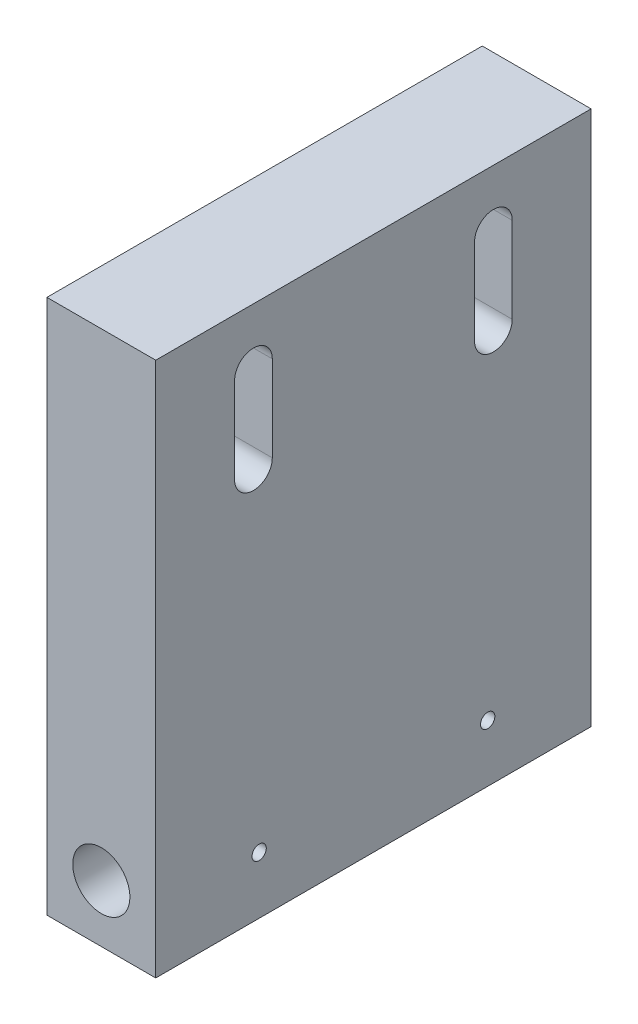
ISO-10303-21;
HEADER;
FILE_DESCRIPTION(('STEP AP214'),'2;1');
FILE_NAME('part.step','',(''),(''),'','','');
FILE_SCHEMA(('AUTOMOTIVE_DESIGN { 1 0 10303 214 1 1 1 1 }'));
ENDSEC;
DATA;
#1=APPLICATION_CONTEXT('core data for automotive mechanical design processes');
#2=APPLICATION_PROTOCOL_DEFINITION('international standard','automotive_design',2000,#1);
#3=PRODUCT_CONTEXT('',#1,'mechanical');
#4=PRODUCT('Part','Part','',(#3));
#5=PRODUCT_RELATED_PRODUCT_CATEGORY('part','',(#4));
#6=PRODUCT_DEFINITION_FORMATION('','',#4);
#7=PRODUCT_DEFINITION_CONTEXT('part definition',#1,'design');
#8=PRODUCT_DEFINITION('design','',#6,#7);
#9=PRODUCT_DEFINITION_SHAPE('','',#8);
#10=(LENGTH_UNIT() NAMED_UNIT(*) SI_UNIT(.MILLI.,.METRE.));
#11=(NAMED_UNIT(*) PLANE_ANGLE_UNIT() SI_UNIT($,.RADIAN.));
#12=(NAMED_UNIT(*) SI_UNIT($,.STERADIAN.) SOLID_ANGLE_UNIT());
#13=UNCERTAINTY_MEASURE_WITH_UNIT(LENGTH_MEASURE(1.E-05),#10,'distance_accuracy_value','');
#14=(GEOMETRIC_REPRESENTATION_CONTEXT(3) GLOBAL_UNCERTAINTY_ASSIGNED_CONTEXT((#13)) GLOBAL_UNIT_ASSIGNED_CONTEXT((#10,
#11,#12)) REPRESENTATION_CONTEXT('',''));
#15=CARTESIAN_POINT('',(0.,0.,0.));
#16=DIRECTION('',(0.,0.,1.));
#17=DIRECTION('',(1.,0.,0.));
#18=AXIS2_PLACEMENT_3D('',#15,#16,#17);
#19=CARTESIAN_POINT('',(9.52499999999986,0.,38.1));
#20=DIRECTION('',(-1.,0.,0.));
#21=DIRECTION('',(0.,0.,1.));
#22=AXIS2_PLACEMENT_3D('',#19,#20,#21);
#23=PLANE('',#22);
#24=DIRECTION('',(0.,-1.,0.));
#25=VECTOR('',#24,1.);
#26=CARTESIAN_POINT('',(9.52500000000006,83.65,-17.7));
#27=LINE('',#26,#25);
#28=CARTESIAN_POINT('',(9.52500000000006,83.65,-17.7));
#29=VERTEX_POINT('',#28);
#30=CARTESIAN_POINT('',(9.52500000000006,68.65,-17.7));
#31=VERTEX_POINT('',#30);
#32=EDGE_CURVE('E171',#29,#31,#27,.T.);
#33=ORIENTED_EDGE('',*,*,#32,.F.);
#34=CARTESIAN_POINT('',(9.52500000000007,83.65,-21.));
#35=DIRECTION('',(1.,0.,0.));
#36=DIRECTION('',(0.,0.,1.));
#37=AXIS2_PLACEMENT_3D('',#34,#35,#36);
#38=CIRCLE('',#37,3.3);
#39=CARTESIAN_POINT('',(9.52500000000008,83.65,-24.3));
#40=VERTEX_POINT('',#39);
#41=EDGE_CURVE('E67',#40,#29,#38,.T.);
#42=ORIENTED_EDGE('',*,*,#41,.F.);
#43=DIRECTION('',(0.,1.,0.));
#44=VECTOR('',#43,1.);
#45=CARTESIAN_POINT('',(9.52500000000008,83.65,-24.3));
#46=LINE('',#45,#44);
#47=CARTESIAN_POINT('',(9.52500000000008,68.65,-24.3));
#48=VERTEX_POINT('',#47);
#49=EDGE_CURVE('E159',#48,#40,#46,.T.);
#50=ORIENTED_EDGE('',*,*,#49,.F.);
#51=CARTESIAN_POINT('',(9.52500000000007,68.65,-21.));
#52=DIRECTION('',(1.,0.,0.));
#53=DIRECTION('',(0.,0.,1.));
#54=AXIS2_PLACEMENT_3D('',#51,#52,#53);
#55=CIRCLE('',#54,3.3);
#56=EDGE_CURVE('E162',#31,#48,#55,.T.);
#57=ORIENTED_EDGE('',*,*,#56,.F.);
#58=EDGE_LOOP('',(#33,#42,#50,#57));
#59=FACE_BOUND('',#58,.T.);
#60=DIRECTION('',(0.,-1.,0.));
#61=VECTOR('',#60,1.);
#62=CARTESIAN_POINT('',(9.52499999999992,83.65,24.3000000000001));
#63=LINE('',#62,#61);
#64=CARTESIAN_POINT('',(9.52499999999991,83.65,24.3000000000001));
#65=VERTEX_POINT('',#64);
#66=CARTESIAN_POINT('',(9.52499999999991,68.65,24.3000000000001));
#67=VERTEX_POINT('',#66);
#68=EDGE_CURVE('E196',#65,#67,#63,.T.);
#69=ORIENTED_EDGE('',*,*,#68,.F.);
#70=CARTESIAN_POINT('',(9.52499999999993,83.65,21.0000000000001));
#71=DIRECTION('',(1.,0.,0.));
#72=DIRECTION('',(0.,0.,-1.));
#73=AXIS2_PLACEMENT_3D('',#70,#71,#72);
#74=CIRCLE('',#73,3.3);
#75=CARTESIAN_POINT('',(9.52499999999994,83.65,17.7000000000001));
#76=VERTEX_POINT('',#75);
#77=EDGE_CURVE('E177',#76,#65,#74,.T.);
#78=ORIENTED_EDGE('',*,*,#77,.F.);
#79=DIRECTION('',(0.,1.,0.));
#80=VECTOR('',#79,1.);
#81=CARTESIAN_POINT('',(9.52499999999994,83.65,17.7000000000001));
#82=LINE('',#81,#80);
#83=CARTESIAN_POINT('',(9.52499999999994,68.65,17.7000000000001));
#84=VERTEX_POINT('',#83);
#85=EDGE_CURVE('E185',#84,#76,#82,.T.);
#86=ORIENTED_EDGE('',*,*,#85,.F.);
#87=CARTESIAN_POINT('',(9.52499999999993,68.65,21.0000000000001));
#88=DIRECTION('',(1.,0.,0.));
#89=DIRECTION('',(0.,0.,-1.));
#90=AXIS2_PLACEMENT_3D('',#87,#88,#89);
#91=CIRCLE('',#90,3.3);
#92=EDGE_CURVE('E199',#67,#84,#91,.T.);
#93=ORIENTED_EDGE('',*,*,#92,.F.);
#94=EDGE_LOOP('',(#69,#78,#86,#93));
#95=FACE_BOUND('',#94,.T.);
#96=DIRECTION('',(0.,0.,1.));
#97=VECTOR('',#96,1.);
#98=CARTESIAN_POINT('',(9.52499999999986,93.65,38.1));
#99=LINE('',#98,#97);
#100=CARTESIAN_POINT('',(9.52500000000014,93.65,-38.1));
#101=VERTEX_POINT('',#100);
#102=CARTESIAN_POINT('',(9.52499999999986,93.65,38.1));
#103=VERTEX_POINT('',#102);
#104=EDGE_CURVE('E226',#101,#103,#99,.T.);
#105=ORIENTED_EDGE('',*,*,#104,.T.);
#106=DIRECTION('',(0.,1.,0.));
#107=VECTOR('',#106,1.);
#108=CARTESIAN_POINT('',(9.52499999999986,0.,38.1));
#109=LINE('',#108,#107);
#110=CARTESIAN_POINT('',(9.52499999999986,0.,38.1));
#111=VERTEX_POINT('',#110);
#112=EDGE_CURVE('E60',#111,#103,#109,.T.);
#113=ORIENTED_EDGE('',*,*,#112,.F.);
#114=DIRECTION('',(0.,0.,1.));
#115=VECTOR('',#114,1.);
#116=CARTESIAN_POINT('',(9.52499999999986,0.,38.1));
#117=LINE('',#116,#115);
#118=CARTESIAN_POINT('',(9.52500000000014,0.,-38.1));
#119=VERTEX_POINT('',#118);
#120=EDGE_CURVE('E216',#119,#111,#117,.T.);
#121=ORIENTED_EDGE('',*,*,#120,.F.);
#122=DIRECTION('',(0.,1.,0.));
#123=VECTOR('',#122,1.);
#124=CARTESIAN_POINT('',(9.52500000000014,0.,-38.1));
#125=LINE('',#124,#123);
#126=EDGE_CURVE('E12',#119,#101,#125,.T.);
#127=ORIENTED_EDGE('',*,*,#126,.T.);
#128=EDGE_LOOP('',(#105,#113,#121,#127));
#129=FACE_BOUND('',#128,.T.);
#130=CARTESIAN_POINT('',(9.52499999999993,10.,20.));
#131=DIRECTION('',(1.,0.,0.));
#132=DIRECTION('',(0.,0.,-1.));
#133=AXIS2_PLACEMENT_3D('',#130,#131,#132);
#134=CIRCLE('',#133,1.24999999999999);
#135=CARTESIAN_POINT('',(9.52499999999993,10.,18.75));
#136=VERTEX_POINT('',#135);
#137=EDGE_CURVE('E261',#136,#136,#134,.T.);
#138=ORIENTED_EDGE('',*,*,#137,.F.);
#139=EDGE_LOOP('',(#138));
#140=FACE_BOUND('',#139,.T.);
#141=CARTESIAN_POINT('',(9.52500000000007,10.,-20.));
#142=DIRECTION('',(1.,0.,0.));
#143=DIRECTION('',(0.,0.,-1.));
#144=AXIS2_PLACEMENT_3D('',#141,#142,#143);
#145=CIRCLE('',#144,1.24999999999999);
#146=CARTESIAN_POINT('',(9.52500000000007,10.,-21.25));
#147=VERTEX_POINT('',#146);
#148=EDGE_CURVE('E264',#147,#147,#145,.T.);
#149=ORIENTED_EDGE('',*,*,#148,.F.);
#150=EDGE_LOOP('',(#149));
#151=FACE_BOUND('',#150,.T.);
#152=ADVANCED_FACE('F52',(#59,#95,#129,#140,#151),#23,.F.);
#153=CARTESIAN_POINT('',(-9.52499999999987,0.,-38.1));
#154=DIRECTION('',(0.,0.,1.));
#155=DIRECTION('',(1.,0.,0.));
#156=AXIS2_PLACEMENT_3D('',#153,#154,#155);
#157=PLANE('',#156);
#158=CARTESIAN_POINT('',(1.38777878078145E-13,10.,-38.1));
#159=DIRECTION('',(0.,0.,-1.));
#160=DIRECTION('',(0.,1.,0.));
#161=AXIS2_PLACEMENT_3D('',#158,#159,#160);
#162=CIRCLE('',#161,4.99999999999999);
#163=CARTESIAN_POINT('',(1.38777878078145E-13,15.,-38.1));
#164=VERTEX_POINT('',#163);
#165=EDGE_CURVE('E302',#164,#164,#162,.T.);
#166=ORIENTED_EDGE('',*,*,#165,.F.);
#167=EDGE_LOOP('',(#166));
#168=FACE_BOUND('',#167,.T.);
#169=DIRECTION('',(1.,0.,0.));
#170=VECTOR('',#169,1.);
#171=CARTESIAN_POINT('',(-9.52499999999987,93.65,-38.1));
#172=LINE('',#171,#170);
#173=CARTESIAN_POINT('',(-9.52499999999987,93.65,-38.1));
#174=VERTEX_POINT('',#173);
#175=EDGE_CURVE('E206',#174,#101,#172,.T.);
#176=ORIENTED_EDGE('',*,*,#175,.T.);
#177=ORIENTED_EDGE('',*,*,#126,.F.);
#178=DIRECTION('',(1.,0.,0.));
#179=VECTOR('',#178,1.);
#180=CARTESIAN_POINT('',(-9.52499999999987,0.,-38.1));
#181=LINE('',#180,#179);
#182=CARTESIAN_POINT('',(-9.52499999999987,0.,-38.1));
#183=VERTEX_POINT('',#182);
#184=EDGE_CURVE('E213',#183,#119,#181,.T.);
#185=ORIENTED_EDGE('',*,*,#184,.F.);
#186=DIRECTION('',(0.,1.,0.));
#187=VECTOR('',#186,1.);
#188=CARTESIAN_POINT('',(-9.52499999999987,0.,-38.1));
#189=LINE('',#188,#187);
#190=EDGE_CURVE('E223',#183,#174,#189,.T.);
#191=ORIENTED_EDGE('',*,*,#190,.T.);
#192=EDGE_LOOP('',(#176,#177,#185,#191));
#193=FACE_BOUND('',#192,.T.);
#194=ADVANCED_FACE('F54',(#168,#193),#157,.F.);
#195=CARTESIAN_POINT('',(-9.52500000000014,0.,38.1));
#196=DIRECTION('',(0.,0.,-1.));
#197=DIRECTION('',(-1.,0.,0.));
#198=AXIS2_PLACEMENT_3D('',#195,#196,#197);
#199=PLANE('',#198);
#200=CARTESIAN_POINT('',(1.38777878078145E-13,10.,38.1));
#201=DIRECTION('',(0.,0.,-1.));
#202=DIRECTION('',(0.,1.,0.));
#203=AXIS2_PLACEMENT_3D('',#200,#201,#202);
#204=CIRCLE('',#203,4.99999999999998);
#205=CARTESIAN_POINT('',(1.38777878078145E-13,15.,38.1));
#206=VERTEX_POINT('',#205);
#207=EDGE_CURVE('E165',#206,#206,#204,.T.);
#208=ORIENTED_EDGE('',*,*,#207,.T.);
#209=EDGE_LOOP('',(#208));
#210=FACE_BOUND('',#209,.T.);
#211=DIRECTION('',(-1.,0.,0.));
#212=VECTOR('',#211,1.);
#213=CARTESIAN_POINT('',(-9.52500000000014,93.65,38.1));
#214=LINE('',#213,#212);
#215=CARTESIAN_POINT('',(-9.52500000000014,93.65,38.1));
#216=VERTEX_POINT('',#215);
#217=EDGE_CURVE('E228',#103,#216,#214,.T.);
#218=ORIENTED_EDGE('',*,*,#217,.T.);
#219=DIRECTION('',(0.,1.,0.));
#220=VECTOR('',#219,1.);
#221=CARTESIAN_POINT('',(-9.52500000000014,0.,38.1));
#222=LINE('',#221,#220);
#223=CARTESIAN_POINT('',(-9.52500000000014,0.,38.1));
#224=VERTEX_POINT('',#223);
#225=EDGE_CURVE('E233',#224,#216,#222,.T.);
#226=ORIENTED_EDGE('',*,*,#225,.F.);
#227=DIRECTION('',(-1.,0.,0.));
#228=VECTOR('',#227,1.);
#229=CARTESIAN_POINT('',(-9.52500000000014,0.,38.1));
#230=LINE('',#229,#228);
#231=EDGE_CURVE('E219',#111,#224,#230,.T.);
#232=ORIENTED_EDGE('',*,*,#231,.F.);
#233=ORIENTED_EDGE('',*,*,#112,.T.);
#234=EDGE_LOOP('',(#218,#226,#232,#233));
#235=FACE_BOUND('',#234,.T.);
#236=ADVANCED_FACE('F240',(#210,#235),#199,.F.);
#237=CARTESIAN_POINT('',(-9.52500000000014,0.,38.1));
#238=DIRECTION('',(1.,0.,0.));
#239=DIRECTION('',(0.,0.,-1.));
#240=AXIS2_PLACEMENT_3D('',#237,#238,#239);
#241=PLANE('',#240);
#242=DIRECTION('',(0.,1.,0.));
#243=VECTOR('',#242,1.);
#244=CARTESIAN_POINT('',(-9.52500000000019,83.65,-24.3000000000001));
#245=LINE('',#244,#243);
#246=CARTESIAN_POINT('',(-9.52500000000019,68.65,-24.3000000000001));
#247=VERTEX_POINT('',#246);
#248=CARTESIAN_POINT('',(-9.52500000000019,83.65,-24.3000000000001));
#249=VERTEX_POINT('',#248);
#250=EDGE_CURVE('E149',#247,#249,#245,.T.);
#251=ORIENTED_EDGE('',*,*,#250,.T.);
#252=CARTESIAN_POINT('',(-9.5250000000002,83.65,-21.0000000000001));
#253=DIRECTION('',(1.,0.,0.));
#254=DIRECTION('',(0.,0.,1.));
#255=AXIS2_PLACEMENT_3D('',#252,#253,#254);
#256=CIRCLE('',#255,3.3);
#257=CARTESIAN_POINT('',(-9.52500000000021,83.65,-17.7000000000001));
#258=VERTEX_POINT('',#257);
#259=EDGE_CURVE('E143',#249,#258,#256,.T.);
#260=ORIENTED_EDGE('',*,*,#259,.T.);
#261=DIRECTION('',(0.,-1.,0.));
#262=VECTOR('',#261,1.);
#263=CARTESIAN_POINT('',(-9.52500000000021,83.65,-17.7000000000001));
#264=LINE('',#263,#262);
#265=CARTESIAN_POINT('',(-9.52499999999994,68.65,-17.7000000000001));
#266=VERTEX_POINT('',#265);
#267=EDGE_CURVE('E152',#258,#266,#264,.T.);
#268=ORIENTED_EDGE('',*,*,#267,.T.);
#269=CARTESIAN_POINT('',(-9.5250000000002,68.65,-21.0000000000001));
#270=DIRECTION('',(1.,0.,0.));
#271=DIRECTION('',(0.,0.,1.));
#272=AXIS2_PLACEMENT_3D('',#269,#270,#271);
#273=CIRCLE('',#272,3.3);
#274=EDGE_CURVE('E75',#266,#247,#273,.T.);
#275=ORIENTED_EDGE('',*,*,#274,.T.);
#276=EDGE_LOOP('',(#251,#260,#268,#275));
#277=FACE_BOUND('',#276,.T.);
#278=DIRECTION('',(0.,1.,0.));
#279=VECTOR('',#278,1.);
#280=CARTESIAN_POINT('',(-9.52500000000034,83.65,17.7));
#281=LINE('',#280,#279);
#282=CARTESIAN_POINT('',(-9.52500000000034,68.65,17.7));
#283=VERTEX_POINT('',#282);
#284=CARTESIAN_POINT('',(-9.52500000000034,83.65,17.7));
#285=VERTEX_POINT('',#284);
#286=EDGE_CURVE('E191',#283,#285,#281,.T.);
#287=ORIENTED_EDGE('',*,*,#286,.T.);
#288=CARTESIAN_POINT('',(-9.52500000000035,83.65,21.));
#289=DIRECTION('',(1.,0.,0.));
#290=DIRECTION('',(0.,0.,-1.));
#291=AXIS2_PLACEMENT_3D('',#288,#289,#290);
#292=CIRCLE('',#291,3.3);
#293=CARTESIAN_POINT('',(-9.52500000000036,83.65,24.3));
#294=VERTEX_POINT('',#293);
#295=EDGE_CURVE('E181',#285,#294,#292,.T.);
#296=ORIENTED_EDGE('',*,*,#295,.T.);
#297=DIRECTION('',(0.,-1.,0.));
#298=VECTOR('',#297,1.);
#299=CARTESIAN_POINT('',(-9.52500000000036,83.65,24.3));
#300=LINE('',#299,#298);
#301=CARTESIAN_POINT('',(-9.52500000000009,68.65,24.3));
#302=VERTEX_POINT('',#301);
#303=EDGE_CURVE('E184',#294,#302,#300,.T.);
#304=ORIENTED_EDGE('',*,*,#303,.T.);
#305=CARTESIAN_POINT('',(-9.52500000000035,68.65,21.));
#306=DIRECTION('',(1.,0.,0.));
#307=DIRECTION('',(0.,0.,-1.));
#308=AXIS2_PLACEMENT_3D('',#305,#306,#307);
#309=CIRCLE('',#308,3.3);
#310=EDGE_CURVE('E188',#302,#283,#309,.T.);
#311=ORIENTED_EDGE('',*,*,#310,.T.);
#312=EDGE_LOOP('',(#287,#296,#304,#311));
#313=FACE_BOUND('',#312,.T.);
#314=DIRECTION('',(0.,0.,-1.));
#315=VECTOR('',#314,1.);
#316=CARTESIAN_POINT('',(-9.52500000000014,93.65,38.1));
#317=LINE('',#316,#315);
#318=EDGE_CURVE('E217',#216,#174,#317,.T.);
#319=ORIENTED_EDGE('',*,*,#318,.T.);
#320=ORIENTED_EDGE('',*,*,#190,.F.);
#321=DIRECTION('',(0.,0.,-1.));
#322=VECTOR('',#321,1.);
#323=CARTESIAN_POINT('',(-9.52500000000014,0.,38.1));
#324=LINE('',#323,#322);
#325=EDGE_CURVE('E221',#224,#183,#324,.T.);
#326=ORIENTED_EDGE('',*,*,#325,.F.);
#327=ORIENTED_EDGE('',*,*,#225,.T.);
#328=EDGE_LOOP('',(#319,#320,#326,#327));
#329=FACE_BOUND('',#328,.T.);
#330=ADVANCED_FACE('F156',(#277,#313,#329),#241,.F.);
#331=CARTESIAN_POINT('',(0.,0.,0.));
#332=DIRECTION('',(0.,1.,0.));
#333=DIRECTION('',(-1.,0.,0.));
#334=AXIS2_PLACEMENT_3D('',#331,#332,#333);
#335=PLANE('',#334);
#336=ORIENTED_EDGE('',*,*,#184,.T.);
#337=ORIENTED_EDGE('',*,*,#120,.T.);
#338=ORIENTED_EDGE('',*,*,#231,.T.);
#339=ORIENTED_EDGE('',*,*,#325,.T.);
#340=EDGE_LOOP('',(#336,#337,#338,#339));
#341=FACE_BOUND('',#340,.T.);
#342=ADVANCED_FACE('F254',(#341),#335,.F.);
#343=CARTESIAN_POINT('',(0.,93.65,0.));
#344=DIRECTION('',(0.,1.,0.));
#345=DIRECTION('',(-1.,0.,0.));
#346=AXIS2_PLACEMENT_3D('',#343,#344,#345);
#347=PLANE('',#346);
#348=ORIENTED_EDGE('',*,*,#175,.F.);
#349=ORIENTED_EDGE('',*,*,#318,.F.);
#350=ORIENTED_EDGE('',*,*,#217,.F.);
#351=ORIENTED_EDGE('',*,*,#104,.F.);
#352=EDGE_LOOP('',(#348,#349,#350,#351));
#353=FACE_BOUND('',#352,.T.);
#354=ADVANCED_FACE('F246',(#353),#347,.T.);
#355=CARTESIAN_POINT('',(-9.52500000000035,83.65,21.));
#356=DIRECTION('',(1.,0.,0.));
#357=DIRECTION('',(0.,0.,-1.));
#358=AXIS2_PLACEMENT_3D('',#355,#356,#357);
#359=CYLINDRICAL_SURFACE('',#358,3.3);
#360=ORIENTED_EDGE('',*,*,#77,.T.);
#361=DIRECTION('',(1.,0.,0.));
#362=VECTOR('',#361,1.);
#363=CARTESIAN_POINT('',(-9.52500000000036,83.65,24.3));
#364=LINE('',#363,#362);
#365=EDGE_CURVE('E194',#294,#65,#364,.T.);
#366=ORIENTED_EDGE('',*,*,#365,.F.);
#367=ORIENTED_EDGE('',*,*,#295,.F.);
#368=DIRECTION('',(1.,0.,0.));
#369=VECTOR('',#368,1.);
#370=CARTESIAN_POINT('',(-9.52500000000034,83.65,17.7));
#371=LINE('',#370,#369);
#372=EDGE_CURVE('E204',#285,#76,#371,.T.);
#373=ORIENTED_EDGE('',*,*,#372,.T.);
#374=EDGE_LOOP('',(#360,#366,#367,#373));
#375=FACE_BOUND('',#374,.T.);
#376=ADVANCED_FACE('F326',(#375),#359,.F.);
#377=CARTESIAN_POINT('',(-9.52500000000034,83.65,17.7));
#378=DIRECTION('',(0.,0.,-1.));
#379=DIRECTION('',(-1.,0.,0.));
#380=AXIS2_PLACEMENT_3D('',#377,#378,#379);
#381=PLANE('',#380);
#382=ORIENTED_EDGE('',*,*,#85,.T.);
#383=ORIENTED_EDGE('',*,*,#372,.F.);
#384=ORIENTED_EDGE('',*,*,#286,.F.);
#385=DIRECTION('',(1.,0.,0.));
#386=VECTOR('',#385,1.);
#387=CARTESIAN_POINT('',(-9.52500000000034,68.65,17.7));
#388=LINE('',#387,#386);
#389=EDGE_CURVE('E207',#283,#84,#388,.T.);
#390=ORIENTED_EDGE('',*,*,#389,.T.);
#391=EDGE_LOOP('',(#382,#383,#384,#390));
#392=FACE_BOUND('',#391,.T.);
#393=ADVANCED_FACE('F322',(#392),#381,.F.);
#394=CARTESIAN_POINT('',(-9.52500000000035,68.65,21.));
#395=DIRECTION('',(1.,0.,0.));
#396=DIRECTION('',(0.,0.,-1.));
#397=AXIS2_PLACEMENT_3D('',#394,#395,#396);
#398=CYLINDRICAL_SURFACE('',#397,3.3);
#399=ORIENTED_EDGE('',*,*,#92,.T.);
#400=ORIENTED_EDGE('',*,*,#389,.F.);
#401=ORIENTED_EDGE('',*,*,#310,.F.);
#402=DIRECTION('',(1.,0.,0.));
#403=VECTOR('',#402,1.);
#404=CARTESIAN_POINT('',(-9.52500000000036,68.65,24.3));
#405=LINE('',#404,#403);
#406=EDGE_CURVE('E209',#302,#67,#405,.T.);
#407=ORIENTED_EDGE('',*,*,#406,.T.);
#408=EDGE_LOOP('',(#399,#400,#401,#407));
#409=FACE_BOUND('',#408,.T.);
#410=ADVANCED_FACE('F325',(#409),#398,.F.);
#411=CARTESIAN_POINT('',(-9.52500000000036,83.65,24.3));
#412=DIRECTION('',(0.,0.,1.));
#413=DIRECTION('',(1.,0.,0.));
#414=AXIS2_PLACEMENT_3D('',#411,#412,#413);
#415=PLANE('',#414);
#416=ORIENTED_EDGE('',*,*,#68,.T.);
#417=ORIENTED_EDGE('',*,*,#406,.F.);
#418=ORIENTED_EDGE('',*,*,#303,.F.);
#419=ORIENTED_EDGE('',*,*,#365,.T.);
#420=EDGE_LOOP('',(#416,#417,#418,#419));
#421=FACE_BOUND('',#420,.T.);
#422=ADVANCED_FACE('F321',(#421),#415,.F.);
#423=CARTESIAN_POINT('',(-9.5250000000002,83.65,-21.0000000000001));
#424=DIRECTION('',(1.,0.,0.));
#425=DIRECTION('',(0.,0.,-1.));
#426=AXIS2_PLACEMENT_3D('',#423,#424,#425);
#427=CYLINDRICAL_SURFACE('',#426,3.3);
#428=ORIENTED_EDGE('',*,*,#41,.T.);
#429=DIRECTION('',(1.,0.,0.));
#430=VECTOR('',#429,1.);
#431=CARTESIAN_POINT('',(-9.52500000000021,83.65,-17.7000000000001));
#432=LINE('',#431,#430);
#433=EDGE_CURVE('E139',#258,#29,#432,.T.);
#434=ORIENTED_EDGE('',*,*,#433,.F.);
#435=ORIENTED_EDGE('',*,*,#259,.F.);
#436=DIRECTION('',(1.,0.,0.));
#437=VECTOR('',#436,1.);
#438=CARTESIAN_POINT('',(-9.52500000000019,83.65,-24.3000000000001));
#439=LINE('',#438,#437);
#440=EDGE_CURVE('E175',#249,#40,#439,.T.);
#441=ORIENTED_EDGE('',*,*,#440,.T.);
#442=EDGE_LOOP('',(#428,#434,#435,#441));
#443=FACE_BOUND('',#442,.T.);
#444=ADVANCED_FACE('F141',(#443),#427,.F.);
#445=CARTESIAN_POINT('',(-9.52500000000019,83.65,-24.3000000000001));
#446=DIRECTION('',(0.,0.,-1.));
#447=DIRECTION('',(-1.,0.,0.));
#448=AXIS2_PLACEMENT_3D('',#445,#446,#447);
#449=PLANE('',#448);
#450=ORIENTED_EDGE('',*,*,#49,.T.);
#451=ORIENTED_EDGE('',*,*,#440,.F.);
#452=ORIENTED_EDGE('',*,*,#250,.F.);
#453=DIRECTION('',(1.,0.,0.));
#454=VECTOR('',#453,1.);
#455=CARTESIAN_POINT('',(-9.52500000000019,68.65,-24.3000000000001));
#456=LINE('',#455,#454);
#457=EDGE_CURVE('E178',#247,#48,#456,.T.);
#458=ORIENTED_EDGE('',*,*,#457,.T.);
#459=EDGE_LOOP('',(#450,#451,#452,#458));
#460=FACE_BOUND('',#459,.T.);
#461=ADVANCED_FACE('F310',(#460),#449,.F.);
#462=CARTESIAN_POINT('',(-9.5250000000002,68.65,-21.0000000000001));
#463=DIRECTION('',(1.,0.,0.));
#464=DIRECTION('',(0.,0.,-1.));
#465=AXIS2_PLACEMENT_3D('',#462,#463,#464);
#466=CYLINDRICAL_SURFACE('',#465,3.3);
#467=ORIENTED_EDGE('',*,*,#56,.T.);
#468=ORIENTED_EDGE('',*,*,#457,.F.);
#469=ORIENTED_EDGE('',*,*,#274,.F.);
#470=DIRECTION('',(1.,0.,0.));
#471=VECTOR('',#470,1.);
#472=CARTESIAN_POINT('',(-9.52500000000021,68.65,-17.7000000000001));
#473=LINE('',#472,#471);
#474=EDGE_CURVE('E148',#266,#31,#473,.T.);
#475=ORIENTED_EDGE('',*,*,#474,.T.);
#476=EDGE_LOOP('',(#467,#468,#469,#475));
#477=FACE_BOUND('',#476,.T.);
#478=ADVANCED_FACE('F313',(#477),#466,.F.);
#479=CARTESIAN_POINT('',(-9.52500000000021,83.65,-17.7000000000001));
#480=DIRECTION('',(0.,0.,1.));
#481=DIRECTION('',(1.,0.,0.));
#482=AXIS2_PLACEMENT_3D('',#479,#480,#481);
#483=PLANE('',#482);
#484=ORIENTED_EDGE('',*,*,#32,.T.);
#485=ORIENTED_EDGE('',*,*,#474,.F.);
#486=ORIENTED_EDGE('',*,*,#267,.F.);
#487=ORIENTED_EDGE('',*,*,#433,.T.);
#488=EDGE_LOOP('',(#484,#485,#486,#487));
#489=FACE_BOUND('',#488,.T.);
#490=ADVANCED_FACE('F153',(#489),#483,.F.);
#491=CARTESIAN_POINT('',(1.38777878078145E-13,10.,-38.1));
#492=DIRECTION('',(0.,0.,-1.));
#493=DIRECTION('',(0.,1.,0.));
#494=AXIS2_PLACEMENT_3D('',#491,#492,#493);
#495=CYLINDRICAL_SURFACE('',#494,4.99999999999999);
#496=CARTESIAN_POINT('',(5.00000000000013,10.,-21.25));
#497=CARTESIAN_POINT('',(4.99999883223356,10.0690634072248,-21.2499980618848));
#498=CARTESIAN_POINT('',(4.99855481776536,10.138148464859,-21.2442570410218));
#499=CARTESIAN_POINT('',(4.99293428191589,10.2743386031421,-21.2214790405775));
#500=CARTESIAN_POINT('',(4.98875621183319,10.3414425390589,-21.2044356587184));
#501=CARTESIAN_POINT('',(4.97813021943379,10.4716840601521,-21.1596339554482));
#502=CARTESIAN_POINT('',(4.97168502368418,10.5348263028583,-21.1318885010706));
#503=CARTESIAN_POINT('',(4.95721119839673,10.6555601099204,-21.0665155082959));
#504=CARTESIAN_POINT('',(4.94918251545055,10.7131514869573,-21.0288876365675));
#505=CARTESIAN_POINT('',(4.93222844659847,10.8223349394174,-20.9439993419548));
#506=CARTESIAN_POINT('',(4.9232892262379,10.8737964083842,-20.896573687534));
#507=CARTESIAN_POINT('',(4.90561350097954,10.9681241060027,-20.7937898292425));
#508=CARTESIAN_POINT('',(4.8968770190697,11.0109893641243,-20.7384307308779));
#509=CARTESIAN_POINT('',(4.88045646416438,11.0875221189992,-20.6203373110521));
#510=CARTESIAN_POINT('',(4.87278995392184,11.1210435132711,-20.5575056409913));
#511=CARTESIAN_POINT('',(4.85957912343532,11.1769974237921,-20.426876323618));
#512=CARTESIAN_POINT('',(4.85403446394003,11.1994317128661,-20.3590794722285));
#513=CARTESIAN_POINT('',(4.84583730597972,11.2321290306702,-20.2218804181646));
#514=CARTESIAN_POINT('',(4.84312909229534,11.2426268902778,-20.1525375866251));
#515=CARTESIAN_POINT('',(4.84074468781463,11.2518848125565,-20.0130261924883));
#516=CARTESIAN_POINT('',(4.84106800373882,11.2506467848483,-19.9428577660845));
#517=CARTESIAN_POINT('',(4.84466004580528,11.2366554371994,-19.8054868268796));
#518=CARTESIAN_POINT('',(4.84785719168245,11.2241819501588,-19.7382536487791));
#519=CARTESIAN_POINT('',(4.85672258063749,11.1885201557526,-19.6068657909072));
#520=CARTESIAN_POINT('',(4.86239099975593,11.1653310850578,-19.5427113308092));
#521=CARTESIAN_POINT('',(4.87562594920168,11.108657898281,-19.4185516531233));
#522=CARTESIAN_POINT('',(4.8832110622453,11.0750722226941,-19.358594856842));
#523=CARTESIAN_POINT('',(4.89941425705334,10.9986302300125,-19.2450677418693));
#524=CARTESIAN_POINT('',(4.90803251945625,10.955772290674,-19.1914985432773));
#525=CARTESIAN_POINT('',(4.92563233783163,10.860552853901,-19.090663653588));
#526=CARTESIAN_POINT('',(4.93461724564989,10.8079552151382,-19.0436212582822));
#527=CARTESIAN_POINT('',(4.95171637982334,10.6955099312531,-18.9589822979467));
#528=CARTESIAN_POINT('',(4.95983057957859,10.6356620647566,-18.921386021447));
#529=CARTESIAN_POINT('',(4.97431443411831,10.5100965739012,-18.8566245114797));
#530=CARTESIAN_POINT('',(4.9806780010645,10.4443594943405,-18.829495549788));
#531=CARTESIAN_POINT('',(4.99089930826195,10.3090633401191,-18.7867355785753));
#532=CARTESIAN_POINT('',(4.99475752782747,10.2395049992921,-18.7711023696515));
#533=CARTESIAN_POINT('',(4.99946249392825,10.100449975325,-18.7521186953676));
#534=CARTESIAN_POINT('',(5.00038377923578,10.0309972666568,-18.7484641449372));
#535=CARTESIAN_POINT('',(4.99932337345388,9.89247260433207,-18.7527075017129));
#536=CARTESIAN_POINT('',(4.99734194368218,9.82340061696283,-18.7606043689993));
#537=CARTESIAN_POINT('',(4.99074650939477,9.68865477601959,-18.7874757569928));
#538=CARTESIAN_POINT('',(4.98617195154855,9.6229457341927,-18.8062843862308));
#539=CARTESIAN_POINT('',(4.97490588861791,9.49561892295624,-18.854255903357));
#540=CARTESIAN_POINT('',(4.96821416974923,9.4340015674728,-18.8834198369276));
#541=CARTESIAN_POINT('',(4.95327756605271,9.31539738797513,-18.9518634407289));
#542=CARTESIAN_POINT('',(4.94500722805789,9.25851213180348,-18.9913134269973));
#543=CARTESIAN_POINT('',(4.92787090989529,9.1520611552973,-19.0789915906641));
#544=CARTESIAN_POINT('',(4.91900482709767,9.10249670085583,-19.1272212830141));
#545=CARTESIAN_POINT('',(4.90140797467322,9.01084119327273,-19.232501634037));
#546=CARTESIAN_POINT('',(4.89268586822747,8.96896344364831,-19.289739752502));
#547=CARTESIAN_POINT('',(4.87660731981045,8.89540770082275,-19.4106105287214));
#548=CARTESIAN_POINT('',(4.86925081722534,8.86372925486839,-19.4742429024664));
#549=CARTESIAN_POINT('',(4.85681745612234,8.81170714949226,-19.6057547686776));
#550=CARTESIAN_POINT('',(4.85172712743267,8.79129633612161,-19.6736063569533));
#551=CARTESIAN_POINT('',(4.84438953408499,8.76221195003852,-19.8119246982409));
#552=CARTESIAN_POINT('',(4.84214164766626,8.75353581043446,-19.8823908758604));
#553=CARTESIAN_POINT('',(4.84079084336643,8.74830117472168,-20.0217675198793));
#554=CARTESIAN_POINT('',(4.84159943940232,8.75140175184991,-20.0906645292706));
#555=CARTESIAN_POINT('',(4.84606590839882,8.76885226807262,-20.2269199072233));
#556=CARTESIAN_POINT('',(4.84972372409893,8.78320198109436,-20.294278306678));
#557=CARTESIAN_POINT('',(4.85942717235615,8.82255723379768,-20.4251737158878));
#558=CARTESIAN_POINT('',(4.8654584603027,8.84749882943302,-20.4887310877002));
#559=CARTESIAN_POINT('',(4.87923129770703,8.90727923866244,-20.6108044855947));
#560=CARTESIAN_POINT('',(4.8869730843399,8.94211942497151,-20.6693198109891));
#561=CARTESIAN_POINT('',(4.90354695219606,9.02177687613572,-20.7812955241683));
#562=CARTESIAN_POINT('',(4.91240220693144,9.06683069757312,-20.8345842278533));
#563=CARTESIAN_POINT('',(4.93006689371917,9.16517552400856,-20.9329558706628));
#564=CARTESIAN_POINT('',(4.93887631439229,9.21846848228238,-20.9780368584275));
#565=CARTESIAN_POINT('',(4.95564713039732,9.33294367774785,-21.0595094238038));
#566=CARTESIAN_POINT('',(4.96359027804903,9.39425131473635,-21.0957288447263));
#567=CARTESIAN_POINT('',(4.97754104145945,9.52227828374127,-21.1572895524504));
#568=CARTESIAN_POINT('',(4.98355004333164,9.58899369713605,-21.1826386338738));
#569=CARTESIAN_POINT('',(4.9920671630463,9.71299145563044,-21.2179765252747));
#570=CARTESIAN_POINT('',(4.99502154210588,9.76968319090995,-21.2299593692112));
#571=CARTESIAN_POINT('',(4.99898837693303,9.88424494038643,-21.2459716196849));
#572=CARTESIAN_POINT('',(5.00000097875758,9.94211486563115,-21.2500016244211));
#573=CARTESIAN_POINT('',(5.00000000000013,10.,-21.25));
#574=B_SPLINE_CURVE_WITH_KNOTS('',3,(#496,#497,#498,#499,#500,#501,#502,#503,#504,#505,#506,
#507,#508,#509,#510,#511,#512,#513,#514,#515,#516,#517,#518,#519,#520,#521,#522,#523,#524,#525,
#526,#527,#528,#529,#530,#531,#532,#533,#534,#535,#536,#537,#538,#539,#540,#541,#542,#543,#544,
#545,#546,#547,#548,#549,#550,#551,#552,#553,#554,#555,#556,#557,#558,#559,#560,#561,#562,#563,
#564,#565,#566,#567,#568,#569,#570,#571,#572,#573),.UNSPECIFIED.,.T.,.F.,(4,2,2,2,2,2,2,2,2,2,2,
2,2,2,2,2,2,2,2,2,2,2,2,2,2,2,2,2,2,2,2,2,2,2,2,2,2,2,4),(0.,0.206978093726577,
0.414073531469914,0.620920751905087,0.827774950141104,1.03845362864282,1.24915607983384,
1.46298872954839,1.6767871764114,1.88630245916191,2.09578365093913,2.30018747505847,
2.50460586221697,2.71108773228231,2.91760575696801,3.13001250807515,3.34242574631871,
3.55556857507593,3.76867061407201,3.97631924124395,4.1839491759395,4.38850228761696,
4.59307606101907,4.80127989637791,5.00951969173347,5.22287091003728,5.43621265624588,
5.64826878845028,5.86027852710337,6.06619816998841,6.27211367463358,6.47680333799536,
6.68152140114081,6.89157980341589,7.10168808142011,7.31560154582986,7.52936136517788,
7.70285202451787,7.87632963369196),.UNSPECIFIED.);
#575=CARTESIAN_POINT('',(5.00000000000013,10.,-21.25));
#576=VERTEX_POINT('',#575);
#577=EDGE_CURVE('E266',#576,#576,#574,.T.);
#578=ORIENTED_EDGE('',*,*,#577,.T.);
#579=EDGE_LOOP('',(#578));
#580=FACE_BOUND('',#579,.T.);
#581=CARTESIAN_POINT('',(5.00000000000013,10.,18.75));
#582=CARTESIAN_POINT('',(4.99999883223356,10.0690634072248,18.7500019381152));
#583=CARTESIAN_POINT('',(4.99855481776536,10.138148464859,18.7557429589782));
#584=CARTESIAN_POINT('',(4.99293428191589,10.2743386031421,18.7785209594225));
#585=CARTESIAN_POINT('',(4.98875621183319,10.3414425390589,18.7955643412816));
#586=CARTESIAN_POINT('',(4.97813021943379,10.4716840601521,18.8403660445518));
#587=CARTESIAN_POINT('',(4.97168502368418,10.5348263028583,18.8681114989294));
#588=CARTESIAN_POINT('',(4.95721119839673,10.6555601099203,18.933484491704));
#589=CARTESIAN_POINT('',(4.94918251545055,10.7131514869573,18.9711123634325));
#590=CARTESIAN_POINT('',(4.93222844659847,10.8223349394174,19.0560006580452));
#591=CARTESIAN_POINT('',(4.9232892262379,10.8737964083842,19.103426312466));
#592=CARTESIAN_POINT('',(4.90561350097954,10.9681241060027,19.2062101707575));
#593=CARTESIAN_POINT('',(4.8968770190697,11.0109893641243,19.2615692691221));
#594=CARTESIAN_POINT('',(4.88045646416438,11.0875221189992,19.3796626889479));
#595=CARTESIAN_POINT('',(4.87278995392184,11.1210435132711,19.4424943590087));
#596=CARTESIAN_POINT('',(4.85957912343532,11.1769974237921,19.573123676382));
#597=CARTESIAN_POINT('',(4.85403446394003,11.1994317128661,19.6409205277715));
#598=CARTESIAN_POINT('',(4.84583730597972,11.2321290306702,19.7781195818354));
#599=CARTESIAN_POINT('',(4.84312909229534,11.2426268902778,19.8474624133749));
#600=CARTESIAN_POINT('',(4.84074468781463,11.2518848125565,19.9869738075117));
#601=CARTESIAN_POINT('',(4.84106800373882,11.2506467848483,20.0571422339155));
#602=CARTESIAN_POINT('',(4.84466004580528,11.2366554371994,20.1945131731204));
#603=CARTESIAN_POINT('',(4.84785719168245,11.2241819501588,20.2617463512209));
#604=CARTESIAN_POINT('',(4.85672258063749,11.1885201557526,20.3931342090928));
#605=CARTESIAN_POINT('',(4.86239099975593,11.1653310850578,20.4572886691908));
#606=CARTESIAN_POINT('',(4.87562594920168,11.108657898281,20.5814483468767));
#607=CARTESIAN_POINT('',(4.8832110622453,11.0750722226941,20.641405143158));
#608=CARTESIAN_POINT('',(4.89941425705334,10.9986302300125,20.7549322581307));
#609=CARTESIAN_POINT('',(4.90803251945625,10.955772290674,20.8085014567227));
#610=CARTESIAN_POINT('',(4.92563233783163,10.860552853901,20.909336346412));
#611=CARTESIAN_POINT('',(4.93461724564989,10.8079552151382,20.9563787417178));
#612=CARTESIAN_POINT('',(4.95171637982334,10.6955099312531,21.0410177020533));
#613=CARTESIAN_POINT('',(4.95983057957859,10.6356620647566,21.078613978553));
#614=CARTESIAN_POINT('',(4.97431443411831,10.5100965739012,21.1433754885203));
#615=CARTESIAN_POINT('',(4.9806780010645,10.4443594943405,21.170504450212));
#616=CARTESIAN_POINT('',(4.99089930826195,10.3090633401191,21.2132644214247));
#617=CARTESIAN_POINT('',(4.99475752782747,10.2395049992921,21.2288976303485));
#618=CARTESIAN_POINT('',(4.99946249392825,10.100449975325,21.2478813046324));
#619=CARTESIAN_POINT('',(5.00038377923578,10.0309972666568,21.2515358550628));
#620=CARTESIAN_POINT('',(4.99932337345388,9.89247260433207,21.2472924982871));
#621=CARTESIAN_POINT('',(4.99734194368218,9.82340061696283,21.2393956310007));
#622=CARTESIAN_POINT('',(4.99074650939477,9.68865477601959,21.2125242430072));
#623=CARTESIAN_POINT('',(4.98617195154855,9.6229457341927,21.1937156137692));
#624=CARTESIAN_POINT('',(4.97490588861791,9.49561892295624,21.145744096643));
#625=CARTESIAN_POINT('',(4.96821416974923,9.4340015674728,21.1165801630724));
#626=CARTESIAN_POINT('',(4.95327756605271,9.31539738797513,21.0481365592711));
#627=CARTESIAN_POINT('',(4.94500722805789,9.25851213180348,21.0086865730027));
#628=CARTESIAN_POINT('',(4.92787090989529,9.1520611552973,20.9210084093359));
#629=CARTESIAN_POINT('',(4.91900482709767,9.10249670085583,20.8727787169859));
#630=CARTESIAN_POINT('',(4.90140797467322,9.01084119327273,20.767498365963));
#631=CARTESIAN_POINT('',(4.89268586822747,8.96896344364831,20.710260247498));
#632=CARTESIAN_POINT('',(4.87660731981045,8.89540770082275,20.5893894712786));
#633=CARTESIAN_POINT('',(4.86925081722534,8.86372925486839,20.5257570975336));
#634=CARTESIAN_POINT('',(4.85681745612234,8.81170714949226,20.3942452313225));
#635=CARTESIAN_POINT('',(4.85172712743267,8.79129633612161,20.3263936430467));
#636=CARTESIAN_POINT('',(4.84438953408499,8.76221195003852,20.1880753017591));
#637=CARTESIAN_POINT('',(4.84214164766626,8.75353581043446,20.1176091241396));
#638=CARTESIAN_POINT('',(4.84079084336643,8.74830117472168,19.9782324801207));
#639=CARTESIAN_POINT('',(4.84159943940232,8.75140175184991,19.9093354707294));
#640=CARTESIAN_POINT('',(4.84606590839881,8.76885226807261,19.7730800927767));
#641=CARTESIAN_POINT('',(4.84972372409893,8.78320198109436,19.705721693322));
#642=CARTESIAN_POINT('',(4.85942717235615,8.82255723379768,19.5748262841122));
#643=CARTESIAN_POINT('',(4.8654584603027,8.84749882943302,19.5112689122998));
#644=CARTESIAN_POINT('',(4.87923129770703,8.90727923866244,19.3891955144053));
#645=CARTESIAN_POINT('',(4.8869730843399,8.94211942497151,19.3306801890109));
#646=CARTESIAN_POINT('',(4.90354695219606,9.02177687613572,19.2187044758317));
#647=CARTESIAN_POINT('',(4.91240220693144,9.06683069757312,19.1654157721467));
#648=CARTESIAN_POINT('',(4.93006689371917,9.16517552400856,19.0670441293372));
#649=CARTESIAN_POINT('',(4.93887631439229,9.21846848228238,19.0219631415725));
#650=CARTESIAN_POINT('',(4.95564713039732,9.33294367774785,18.9404905761962));
#651=CARTESIAN_POINT('',(4.96359027804903,9.39425131473635,18.9042711552737));
#652=CARTESIAN_POINT('',(4.97754104145945,9.52227828374127,18.8427104475496));
#653=CARTESIAN_POINT('',(4.98355004333164,9.58899369713605,18.8173613661262));
#654=CARTESIAN_POINT('',(4.9920671630463,9.71299145563044,18.7820234747253));
#655=CARTESIAN_POINT('',(4.99502154210588,9.76968319090995,18.7700406307888));
#656=CARTESIAN_POINT('',(4.99898837693303,9.88424494038643,18.7540283803151));
#657=CARTESIAN_POINT('',(5.00000097875758,9.94211486563115,18.7499983755789));
#658=CARTESIAN_POINT('',(5.00000000000013,10.,18.75));
#659=B_SPLINE_CURVE_WITH_KNOTS('',3,(#581,#582,#583,#584,#585,#586,#587,#588,#589,#590,#591,
#592,#593,#594,#595,#596,#597,#598,#599,#600,#601,#602,#603,#604,#605,#606,#607,#608,#609,#610,
#611,#612,#613,#614,#615,#616,#617,#618,#619,#620,#621,#622,#623,#624,#625,#626,#627,#628,#629,
#630,#631,#632,#633,#634,#635,#636,#637,#638,#639,#640,#641,#642,#643,#644,#645,#646,#647,#648,
#649,#650,#651,#652,#653,#654,#655,#656,#657,#658),.UNSPECIFIED.,.T.,.F.,(4,2,2,2,2,2,2,2,2,2,2,
2,2,2,2,2,2,2,2,2,2,2,2,2,2,2,2,2,2,2,2,2,2,2,2,2,2,2,4),(0.,0.206978093726577,
0.414073531469914,0.620920751905082,0.827774950141105,1.03845362864282,1.24915607983384,
1.46298872954839,1.6767871764114,1.88630245916191,2.09578365093913,2.30018747505847,
2.50460586221697,2.71108773228231,2.91760575696801,3.13001250807515,3.34242574631871,
3.55556857507593,3.76867061407201,3.97631924124395,4.1839491759395,4.38850228761696,
4.59307606101907,4.80127989637791,5.00951969173347,5.22287091003728,5.43621265624588,
5.64826878845028,5.86027852710337,6.0661981699884,6.27211367463358,6.47680333799536,
6.68152140114081,6.89157980341589,7.10168808142011,7.31560154582986,7.52936136517788,
7.70285202451787,7.87632963369196),.UNSPECIFIED.);
#660=CARTESIAN_POINT('',(5.00000000000013,10.,18.75));
#661=VERTEX_POINT('',#660);
#662=EDGE_CURVE('E296',#661,#661,#659,.T.);
#663=ORIENTED_EDGE('',*,*,#662,.T.);
#664=EDGE_LOOP('',(#663));
#665=FACE_BOUND('',#664,.T.);
#666=ORIENTED_EDGE('',*,*,#207,.F.);
#667=EDGE_LOOP('',(#666));
#668=FACE_BOUND('',#667,.T.);
#669=ORIENTED_EDGE('',*,*,#165,.T.);
#670=EDGE_LOOP('',(#669));
#671=FACE_BOUND('',#670,.T.);
#672=ADVANCED_FACE('F286',(#580,#665,#668,#671),#495,.F.);
#673=CARTESIAN_POINT('',(9.52499999999993,10.,20.));
#674=DIRECTION('',(1.,0.,0.));
#675=DIRECTION('',(0.,0.,-1.));
#676=AXIS2_PLACEMENT_3D('',#673,#674,#675);
#677=CYLINDRICAL_SURFACE('',#676,1.24999999999999);
#678=ORIENTED_EDGE('',*,*,#662,.F.);
#679=EDGE_LOOP('',(#678));
#680=FACE_BOUND('',#679,.T.);
#681=ORIENTED_EDGE('',*,*,#137,.T.);
#682=EDGE_LOOP('',(#681));
#683=FACE_BOUND('',#682,.T.);
#684=ADVANCED_FACE('F281',(#680,#683),#677,.F.);
#685=CARTESIAN_POINT('',(9.52500000000007,10.,-20.));
#686=DIRECTION('',(1.,0.,0.));
#687=DIRECTION('',(0.,0.,-1.));
#688=AXIS2_PLACEMENT_3D('',#685,#686,#687);
#689=CYLINDRICAL_SURFACE('',#688,1.24999999999999);
#690=ORIENTED_EDGE('',*,*,#577,.F.);
#691=EDGE_LOOP('',(#690));
#692=FACE_BOUND('',#691,.T.);
#693=ORIENTED_EDGE('',*,*,#148,.T.);
#694=EDGE_LOOP('',(#693));
#695=FACE_BOUND('',#694,.T.);
#696=ADVANCED_FACE('F278',(#692,#695),#689,.F.);
#697=CLOSED_SHELL('',(#152,#194,#236,#330,#342,#354,#376,#393,#410,#422,#444,#461,#478,#490,
#672,#684,#696));
#698=MANIFOLD_SOLID_BREP('B2',#697);
#699=ADVANCED_BREP_SHAPE_REPRESENTATION('',(#18,#698),#14);
#700=SHAPE_DEFINITION_REPRESENTATION(#9,#699);
ENDSEC;
END-ISO-10303-21;
